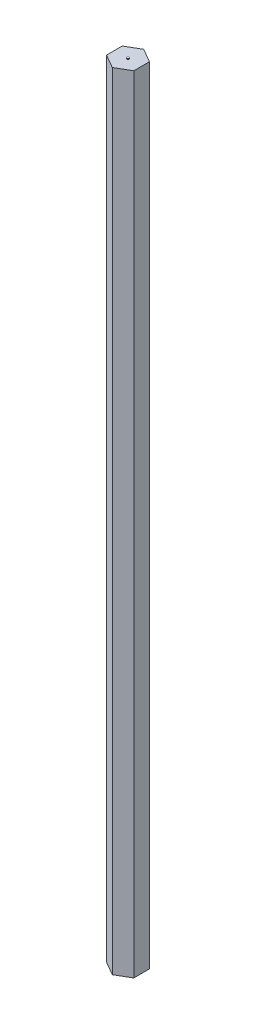
ISO-10303-21;
HEADER;
FILE_DESCRIPTION(('STEP AP214'),'2;1');
FILE_NAME('part.step','',(''),(''),'','','');
FILE_SCHEMA(('AUTOMOTIVE_DESIGN { 1 0 10303 214 1 1 1 1 }'));
ENDSEC;
DATA;
#1=APPLICATION_CONTEXT('core data for automotive mechanical design processes');
#2=APPLICATION_PROTOCOL_DEFINITION('international standard','automotive_design',2000,#1);
#3=PRODUCT_CONTEXT('',#1,'mechanical');
#4=PRODUCT('Part','Part','',(#3));
#5=PRODUCT_RELATED_PRODUCT_CATEGORY('part','',(#4));
#6=PRODUCT_DEFINITION_FORMATION('','',#4);
#7=PRODUCT_DEFINITION_CONTEXT('part definition',#1,'design');
#8=PRODUCT_DEFINITION('design','',#6,#7);
#9=PRODUCT_DEFINITION_SHAPE('','',#8);
#10=(LENGTH_UNIT() NAMED_UNIT(*) SI_UNIT(.MILLI.,.METRE.));
#11=(NAMED_UNIT(*) PLANE_ANGLE_UNIT() SI_UNIT($,.RADIAN.));
#12=(NAMED_UNIT(*) SI_UNIT($,.STERADIAN.) SOLID_ANGLE_UNIT());
#13=UNCERTAINTY_MEASURE_WITH_UNIT(LENGTH_MEASURE(1.E-05),#10,'distance_accuracy_value','');
#14=(GEOMETRIC_REPRESENTATION_CONTEXT(3) GLOBAL_UNCERTAINTY_ASSIGNED_CONTEXT((#13)) GLOBAL_UNIT_ASSIGNED_CONTEXT((#10,
#11,#12)) REPRESENTATION_CONTEXT('',''));
#15=CARTESIAN_POINT('',(0.,0.,0.));
#16=DIRECTION('',(0.,0.,1.));
#17=DIRECTION('',(1.,0.,0.));
#18=AXIS2_PLACEMENT_3D('',#15,#16,#17);
#19=CARTESIAN_POINT('',(866.02540378445,100000.,1499.99999999999));
#20=DIRECTION('',(-0.500000000000007,0.,-0.866025403784435));
#21=DIRECTION('',(-0.866025403784435,0.,0.500000000000007));
#22=AXIS2_PLACEMENT_3D('',#19,#20,#21);
#23=PLANE('',#22);
#24=DIRECTION('',(0.866025403784435,0.,-0.500000000000007));
#25=VECTOR('',#24,1.);
#26=CARTESIAN_POINT('',(866.02540378445,0.,1499.99999999999));
#27=LINE('',#26,#25);
#28=CARTESIAN_POINT('',(1.57651669496772E-11,0.,2000.));
#29=VERTEX_POINT('',#28);
#30=CARTESIAN_POINT('',(1732.05080756888,0.,999.999999999987));
#31=VERTEX_POINT('',#30);
#32=EDGE_CURVE('E118',#29,#31,#27,.T.);
#33=ORIENTED_EDGE('',*,*,#32,.T.);
#34=DIRECTION('',(0.,-1.,0.));
#35=VECTOR('',#34,1.);
#36=CARTESIAN_POINT('',(1732.05080756888,100000.,999.999999999987));
#37=LINE('',#36,#35);
#38=CARTESIAN_POINT('',(1732.05080756888,100000.,999.999999999987));
#39=VERTEX_POINT('',#38);
#40=EDGE_CURVE('E11',#39,#31,#37,.T.);
#41=ORIENTED_EDGE('',*,*,#40,.F.);
#42=DIRECTION('',(0.866025403784435,0.,-0.500000000000007));
#43=VECTOR('',#42,1.);
#44=CARTESIAN_POINT('',(866.02540378445,100000.,1499.99999999999));
#45=LINE('',#44,#43);
#46=CARTESIAN_POINT('',(1.57651669496772E-11,100000.,2000.));
#47=VERTEX_POINT('',#46);
#48=EDGE_CURVE('E129',#47,#39,#45,.T.);
#49=ORIENTED_EDGE('',*,*,#48,.F.);
#50=DIRECTION('',(0.,-1.,0.));
#51=VECTOR('',#50,1.);
#52=CARTESIAN_POINT('',(1.57651669496772E-11,100000.,2000.));
#53=LINE('',#52,#51);
#54=EDGE_CURVE('E114',#47,#29,#53,.T.);
#55=ORIENTED_EDGE('',*,*,#54,.T.);
#56=EDGE_LOOP('',(#33,#41,#49,#55));
#57=FACE_BOUND('',#56,.T.);
#58=ADVANCED_FACE('F34',(#57),#23,.F.);
#59=CARTESIAN_POINT('',(1732.05080756888,100000.,-1.32684425360466E-11));
#60=DIRECTION('',(-1.,0.,0.));
#61=DIRECTION('',(0.,0.,1.));
#62=AXIS2_PLACEMENT_3D('',#59,#60,#61);
#63=PLANE('',#62);
#64=DIRECTION('',(0.,0.,-1.));
#65=VECTOR('',#64,1.);
#66=CARTESIAN_POINT('',(1732.05080756888,0.,-1.32684425360466E-11));
#67=LINE('',#66,#65);
#68=CARTESIAN_POINT('',(1732.05080756887,0.,-1000.00000000001));
#69=VERTEX_POINT('',#68);
#70=EDGE_CURVE('E121',#31,#69,#67,.T.);
#71=ORIENTED_EDGE('',*,*,#70,.T.);
#72=DIRECTION('',(0.,-1.,0.));
#73=VECTOR('',#72,1.);
#74=CARTESIAN_POINT('',(1732.05080756887,100000.,-1000.00000000001));
#75=LINE('',#74,#73);
#76=CARTESIAN_POINT('',(1732.05080756887,100000.,-1000.00000000001));
#77=VERTEX_POINT('',#76);
#78=EDGE_CURVE('E42',#77,#69,#75,.T.);
#79=ORIENTED_EDGE('',*,*,#78,.F.);
#80=DIRECTION('',(0.,0.,-1.));
#81=VECTOR('',#80,1.);
#82=CARTESIAN_POINT('',(1732.05080756888,100000.,-1.32684425360466E-11));
#83=LINE('',#82,#81);
#84=EDGE_CURVE('E87',#39,#77,#83,.T.);
#85=ORIENTED_EDGE('',*,*,#84,.F.);
#86=ORIENTED_EDGE('',*,*,#40,.T.);
#87=EDGE_LOOP('',(#71,#79,#85,#86));
#88=FACE_BOUND('',#87,.T.);
#89=ADVANCED_FACE('F154',(#88),#63,.F.);
#90=CARTESIAN_POINT('',(866.025403784427,100000.,-1500.00000000001));
#91=DIRECTION('',(-0.499999999999993,0.,0.866025403784442));
#92=DIRECTION('',(0.866025403784442,0.,0.499999999999993));
#93=AXIS2_PLACEMENT_3D('',#90,#91,#92);
#94=PLANE('',#93);
#95=DIRECTION('',(-0.866025403784442,0.,-0.499999999999993));
#96=VECTOR('',#95,1.);
#97=CARTESIAN_POINT('',(866.025403784427,0.,-1500.00000000001));
#98=LINE('',#97,#96);
#99=CARTESIAN_POINT('',(-1.46549439250521E-11,0.,-2000.));
#100=VERTEX_POINT('',#99);
#101=EDGE_CURVE('E124',#69,#100,#98,.T.);
#102=ORIENTED_EDGE('',*,*,#101,.T.);
#103=DIRECTION('',(0.,-1.,0.));
#104=VECTOR('',#103,1.);
#105=CARTESIAN_POINT('',(-1.46549439250521E-11,100000.,-2000.));
#106=LINE('',#105,#104);
#107=CARTESIAN_POINT('',(-1.46549439250521E-11,100000.,-2000.));
#108=VERTEX_POINT('',#107);
#109=EDGE_CURVE('E109',#108,#100,#106,.T.);
#110=ORIENTED_EDGE('',*,*,#109,.F.);
#111=DIRECTION('',(-0.866025403784442,0.,-0.499999999999993));
#112=VECTOR('',#111,1.);
#113=CARTESIAN_POINT('',(866.025403784427,100000.,-1500.00000000001));
#114=LINE('',#113,#112);
#115=EDGE_CURVE('E100',#77,#108,#114,.T.);
#116=ORIENTED_EDGE('',*,*,#115,.F.);
#117=ORIENTED_EDGE('',*,*,#78,.T.);
#118=EDGE_LOOP('',(#102,#110,#116,#117));
#119=FACE_BOUND('',#118,.T.);
#120=ADVANCED_FACE('F135',(#119),#94,.F.);
#121=CARTESIAN_POINT('',(-866.025403784449,100000.,-1499.99999999999));
#122=DIRECTION('',(0.500000000000007,0.,0.866025403784435));
#123=DIRECTION('',(0.866025403784435,0.,-0.500000000000007));
#124=AXIS2_PLACEMENT_3D('',#121,#122,#123);
#125=PLANE('',#124);
#126=DIRECTION('',(-0.866025403784435,0.,0.500000000000007));
#127=VECTOR('',#126,1.);
#128=CARTESIAN_POINT('',(-866.025403784449,0.,-1499.99999999999));
#129=LINE('',#128,#127);
#130=CARTESIAN_POINT('',(-1732.05080756888,0.,-999.999999999986));
#131=VERTEX_POINT('',#130);
#132=EDGE_CURVE('E108',#100,#131,#129,.T.);
#133=ORIENTED_EDGE('',*,*,#132,.T.);
#134=DIRECTION('',(0.,-1.,0.));
#135=VECTOR('',#134,1.);
#136=CARTESIAN_POINT('',(-1732.05080756888,100000.,-999.999999999986));
#137=LINE('',#136,#135);
#138=CARTESIAN_POINT('',(-1732.05080756888,100000.,-999.999999999986));
#139=VERTEX_POINT('',#138);
#140=EDGE_CURVE('E105',#139,#131,#137,.T.);
#141=ORIENTED_EDGE('',*,*,#140,.F.);
#142=DIRECTION('',(-0.866025403784435,0.,0.500000000000007));
#143=VECTOR('',#142,1.);
#144=CARTESIAN_POINT('',(-866.025403784449,100000.,-1499.99999999999));
#145=LINE('',#144,#143);
#146=EDGE_CURVE('E94',#108,#139,#145,.T.);
#147=ORIENTED_EDGE('',*,*,#146,.F.);
#148=ORIENTED_EDGE('',*,*,#109,.T.);
#149=EDGE_LOOP('',(#133,#141,#147,#148));
#150=FACE_BOUND('',#149,.T.);
#151=ADVANCED_FACE('F106',(#150),#125,.F.);
#152=CARTESIAN_POINT('',(-1732.05080756888,100000.,1.32684425360466E-11));
#153=DIRECTION('',(1.,0.,0.));
#154=DIRECTION('',(0.,0.,-1.));
#155=AXIS2_PLACEMENT_3D('',#152,#153,#154);
#156=PLANE('',#155);
#157=DIRECTION('',(0.,0.,1.));
#158=VECTOR('',#157,1.);
#159=CARTESIAN_POINT('',(-1732.05080756888,0.,1.32684425360466E-11));
#160=LINE('',#159,#158);
#161=CARTESIAN_POINT('',(-1732.05080756887,0.,1000.00000000001));
#162=VERTEX_POINT('',#161);
#163=EDGE_CURVE('E73',#131,#162,#160,.T.);
#164=ORIENTED_EDGE('',*,*,#163,.T.);
#165=DIRECTION('',(0.,-1.,0.));
#166=VECTOR('',#165,1.);
#167=CARTESIAN_POINT('',(-1732.05080756887,100000.,1000.00000000001));
#168=LINE('',#167,#166);
#169=CARTESIAN_POINT('',(-1732.05080756887,100000.,1000.00000000001));
#170=VERTEX_POINT('',#169);
#171=EDGE_CURVE('E110',#170,#162,#168,.T.);
#172=ORIENTED_EDGE('',*,*,#171,.F.);
#173=DIRECTION('',(0.,0.,1.));
#174=VECTOR('',#173,1.);
#175=CARTESIAN_POINT('',(-1732.05080756888,100000.,1.32684425360466E-11));
#176=LINE('',#175,#174);
#177=EDGE_CURVE('E98',#139,#170,#176,.T.);
#178=ORIENTED_EDGE('',*,*,#177,.F.);
#179=ORIENTED_EDGE('',*,*,#140,.T.);
#180=EDGE_LOOP('',(#164,#172,#178,#179));
#181=FACE_BOUND('',#180,.T.);
#182=ADVANCED_FACE('F112',(#181),#156,.F.);
#183=CARTESIAN_POINT('',(-866.025403784427,100000.,1500.00000000001));
#184=DIRECTION('',(0.499999999999993,0.,-0.866025403784442));
#185=DIRECTION('',(-0.866025403784442,0.,-0.499999999999993));
#186=AXIS2_PLACEMENT_3D('',#183,#184,#185);
#187=PLANE('',#186);
#188=DIRECTION('',(0.866025403784443,0.,0.499999999999994));
#189=VECTOR('',#188,1.);
#190=CARTESIAN_POINT('',(-866.025403784427,0.,1500.00000000001));
#191=LINE('',#190,#189);
#192=EDGE_CURVE('E79',#162,#29,#191,.T.);
#193=ORIENTED_EDGE('',*,*,#192,.T.);
#194=ORIENTED_EDGE('',*,*,#54,.F.);
#195=DIRECTION('',(0.866025403784443,0.,0.499999999999994));
#196=VECTOR('',#195,1.);
#197=CARTESIAN_POINT('',(-866.025403784427,100000.,1500.00000000001));
#198=LINE('',#197,#196);
#199=EDGE_CURVE('E50',#170,#47,#198,.T.);
#200=ORIENTED_EDGE('',*,*,#199,.F.);
#201=ORIENTED_EDGE('',*,*,#171,.T.);
#202=EDGE_LOOP('',(#193,#194,#200,#201));
#203=FACE_BOUND('',#202,.T.);
#204=ADVANCED_FACE('F142',(#203),#187,.F.);
#205=CARTESIAN_POINT('',(0.,100000.,0.));
#206=DIRECTION('',(0.,1.,0.));
#207=DIRECTION('',(0.,0.,1.));
#208=AXIS2_PLACEMENT_3D('',#205,#206,#207);
#209=PLANE('',#208);
#210=CARTESIAN_POINT('',(0.,100000.,0.));
#211=DIRECTION('',(0.,1.,0.));
#212=DIRECTION('',(0.,0.,1.));
#213=AXIS2_PLACEMENT_3D('',#210,#211,#212);
#214=CIRCLE('',#213,150.);
#215=CARTESIAN_POINT('',(0.,100000.,150.));
#216=VERTEX_POINT('',#215);
#217=EDGE_CURVE('E215',#216,#216,#214,.T.);
#218=ORIENTED_EDGE('',*,*,#217,.F.);
#219=EDGE_LOOP('',(#218));
#220=FACE_BOUND('',#219,.T.);
#221=ORIENTED_EDGE('',*,*,#48,.T.);
#222=ORIENTED_EDGE('',*,*,#84,.T.);
#223=ORIENTED_EDGE('',*,*,#115,.T.);
#224=ORIENTED_EDGE('',*,*,#146,.T.);
#225=ORIENTED_EDGE('',*,*,#177,.T.);
#226=ORIENTED_EDGE('',*,*,#199,.T.);
#227=EDGE_LOOP('',(#221,#222,#223,#224,#225,#226));
#228=FACE_BOUND('',#227,.T.);
#229=ADVANCED_FACE('F96',(#220,#228),#209,.T.);
#230=CARTESIAN_POINT('',(0.,0.,0.));
#231=DIRECTION('',(0.,1.,0.));
#232=DIRECTION('',(0.,0.,1.));
#233=AXIS2_PLACEMENT_3D('',#230,#231,#232);
#234=PLANE('',#233);
#235=ORIENTED_EDGE('',*,*,#32,.F.);
#236=ORIENTED_EDGE('',*,*,#192,.F.);
#237=ORIENTED_EDGE('',*,*,#163,.F.);
#238=ORIENTED_EDGE('',*,*,#132,.F.);
#239=ORIENTED_EDGE('',*,*,#101,.F.);
#240=ORIENTED_EDGE('',*,*,#70,.F.);
#241=EDGE_LOOP('',(#235,#236,#237,#238,#239,#240));
#242=FACE_BOUND('',#241,.T.);
#243=ADVANCED_FACE('F138',(#242),#234,.F.);
#244=CARTESIAN_POINT('',(0.,100100.,0.));
#245=DIRECTION('',(0.,-1.,0.));
#246=DIRECTION('',(0.,0.,-1.));
#247=AXIS2_PLACEMENT_3D('',#244,#245,#246);
#248=CYLINDRICAL_SURFACE('',#247,150.);
#249=CARTESIAN_POINT('',(0.,100100.,0.));
#250=DIRECTION('',(0.,1.,0.));
#251=DIRECTION('',(0.,0.,1.));
#252=AXIS2_PLACEMENT_3D('',#249,#250,#251);
#253=CIRCLE('',#252,150.);
#254=CARTESIAN_POINT('',(0.,100100.,150.));
#255=VERTEX_POINT('',#254);
#256=EDGE_CURVE('E122',#255,#255,#253,.T.);
#257=ORIENTED_EDGE('',*,*,#256,.F.);
#258=EDGE_LOOP('',(#257));
#259=FACE_BOUND('',#258,.T.);
#260=ORIENTED_EDGE('',*,*,#217,.T.);
#261=EDGE_LOOP('',(#260));
#262=FACE_BOUND('',#261,.T.);
#263=ADVANCED_FACE('F186',(#259,#262),#248,.T.);
#264=CARTESIAN_POINT('',(0.,100100.,0.));
#265=DIRECTION('',(0.,1.,0.));
#266=DIRECTION('',(0.,0.,1.));
#267=AXIS2_PLACEMENT_3D('',#264,#265,#266);
#268=PLANE('',#267);
#269=ORIENTED_EDGE('',*,*,#256,.T.);
#270=EDGE_LOOP('',(#269));
#271=FACE_BOUND('',#270,.T.);
#272=ADVANCED_FACE('F199',(#271),#268,.T.);
#273=CLOSED_SHELL('',(#58,#89,#120,#151,#182,#204,#229,#243,#263,#272));
#274=MANIFOLD_SOLID_BREP('B2',#273);
#275=ADVANCED_BREP_SHAPE_REPRESENTATION('',(#18,#274),#14);
#276=SHAPE_DEFINITION_REPRESENTATION(#9,#275);
ENDSEC;
END-ISO-10303-21;
